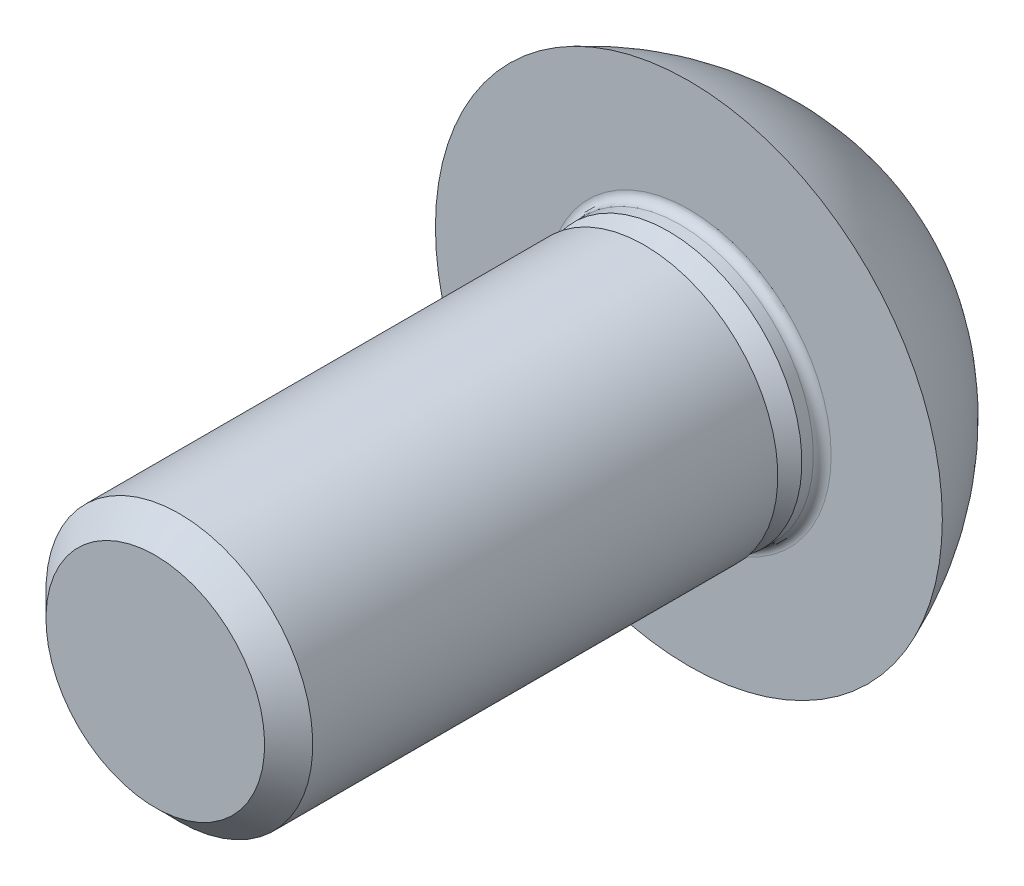
ISO-10303-21;
HEADER;
FILE_DESCRIPTION(('STEP AP214'),'2;1');
FILE_NAME('part.step','',(''),(''),'','','');
FILE_SCHEMA(('AUTOMOTIVE_DESIGN { 1 0 10303 214 1 1 1 1 }'));
ENDSEC;
DATA;
#1=APPLICATION_CONTEXT('core data for automotive mechanical design processes');
#2=APPLICATION_PROTOCOL_DEFINITION('international standard','automotive_design',2000,#1);
#3=PRODUCT_CONTEXT('',#1,'mechanical');
#4=PRODUCT('Part','Part','',(#3));
#5=PRODUCT_RELATED_PRODUCT_CATEGORY('part','',(#4));
#6=PRODUCT_DEFINITION_FORMATION('','',#4);
#7=PRODUCT_DEFINITION_CONTEXT('part definition',#1,'design');
#8=PRODUCT_DEFINITION('design','',#6,#7);
#9=PRODUCT_DEFINITION_SHAPE('','',#8);
#10=(LENGTH_UNIT() NAMED_UNIT(*) SI_UNIT(.MILLI.,.METRE.));
#11=(NAMED_UNIT(*) PLANE_ANGLE_UNIT() SI_UNIT($,.RADIAN.));
#12=(NAMED_UNIT(*) SI_UNIT($,.STERADIAN.) SOLID_ANGLE_UNIT());
#13=UNCERTAINTY_MEASURE_WITH_UNIT(LENGTH_MEASURE(1.E-05),#10,'distance_accuracy_value','');
#14=(GEOMETRIC_REPRESENTATION_CONTEXT(3) GLOBAL_UNCERTAINTY_ASSIGNED_CONTEXT((#13)) GLOBAL_UNIT_ASSIGNED_CONTEXT((#10,
#11,#12)) REPRESENTATION_CONTEXT('',''));
#15=CARTESIAN_POINT('',(0.,0.,0.));
#16=DIRECTION('',(0.,0.,1.));
#17=DIRECTION('',(1.,0.,0.));
#18=AXIS2_PLACEMENT_3D('',#15,#16,#17);
#19=CARTESIAN_POINT('',(0.5,0.866025403784438,-2.65));
#20=DIRECTION('',(0.5,0.866025403784439,0.));
#21=DIRECTION('',(-0.866025403784439,0.5,0.));
#22=AXIS2_PLACEMENT_3D('',#19,#20,#21);
#23=PLANE('',#22);
#24=DIRECTION('',(-0.866025403784439,0.5,0.));
#25=VECTOR('',#24,1.);
#26=CARTESIAN_POINT('',(0.337620236790418,0.959775403784438,-1.65));
#27=LINE('',#26,#25);
#28=CARTESIAN_POINT('',(1.,0.577350269189625,-1.65));
#29=VERTEX_POINT('',#28);
#30=CARTESIAN_POINT('',(0.,1.15470053837925,-1.65));
#31=VERTEX_POINT('',#30);
#32=EDGE_CURVE('E39',#29,#31,#27,.T.);
#33=ORIENTED_EDGE('',*,*,#32,.F.);
#34=DIRECTION('',(0.,0.,1.));
#35=VECTOR('',#34,1.);
#36=CARTESIAN_POINT('',(1.,0.577350269189625,-2.65));
#37=LINE('',#36,#35);
#38=CARTESIAN_POINT('',(1.,0.577350269189625,-0.61));
#39=VERTEX_POINT('',#38);
#40=EDGE_CURVE('E12',#29,#39,#37,.T.);
#41=ORIENTED_EDGE('',*,*,#40,.T.);
#42=DIRECTION('',(0.866025403784439,-0.5,0.));
#43=VECTOR('',#42,1.);
#44=CARTESIAN_POINT('',(1.,0.577350269189625,-0.61));
#45=LINE('',#44,#43);
#46=CARTESIAN_POINT('',(0.5,0.866025403784438,-0.61));
#47=VERTEX_POINT('',#46);
#48=EDGE_CURVE('E235',#47,#39,#45,.T.);
#49=ORIENTED_EDGE('',*,*,#48,.F.);
#50=DIRECTION('',(0.866025403784439,-0.5,0.));
#51=VECTOR('',#50,1.);
#52=CARTESIAN_POINT('',(1.,0.577350269189625,-0.61));
#53=LINE('',#52,#51);
#54=CARTESIAN_POINT('',(0.,1.15470053837925,-0.61));
#55=VERTEX_POINT('',#54);
#56=EDGE_CURVE('E226',#55,#47,#53,.T.);
#57=ORIENTED_EDGE('',*,*,#56,.F.);
#58=DIRECTION('',(0.,0.,1.));
#59=VECTOR('',#58,1.);
#60=CARTESIAN_POINT('',(0.,1.15470053837925,-2.65));
#61=LINE('',#60,#59);
#62=EDGE_CURVE('E31',#31,#55,#61,.T.);
#63=ORIENTED_EDGE('',*,*,#62,.F.);
#64=EDGE_LOOP('',(#33,#41,#49,#57,#63));
#65=FACE_BOUND('',#64,.T.);
#66=ADVANCED_FACE('F19',(#65),#23,.F.);
#67=CARTESIAN_POINT('',(-0.5,0.866025403784439,-2.65));
#68=DIRECTION('',(-0.5,0.866025403784439,0.));
#69=DIRECTION('',(-0.866025403784439,-0.5,0.));
#70=AXIS2_PLACEMENT_3D('',#67,#68,#69);
#71=PLANE('',#70);
#72=DIRECTION('',(-0.866025403784439,-0.5,0.));
#73=VECTOR('',#72,1.);
#74=CARTESIAN_POINT('',(-0.337620236790417,0.959775403784439,-1.65));
#75=LINE('',#74,#73);
#76=CARTESIAN_POINT('',(-1.,0.577350269189626,-1.65));
#77=VERTEX_POINT('',#76);
#78=EDGE_CURVE('E218',#31,#77,#75,.T.);
#79=ORIENTED_EDGE('',*,*,#78,.F.);
#80=ORIENTED_EDGE('',*,*,#62,.T.);
#81=DIRECTION('',(0.866025403784439,0.5,0.));
#82=VECTOR('',#81,1.);
#83=CARTESIAN_POINT('',(0.,1.15470053837925,-0.61));
#84=LINE('',#83,#82);
#85=CARTESIAN_POINT('',(-0.5,0.866025403784439,-0.61));
#86=VERTEX_POINT('',#85);
#87=EDGE_CURVE('E221',#86,#55,#84,.T.);
#88=ORIENTED_EDGE('',*,*,#87,.F.);
#89=DIRECTION('',(0.866025403784439,0.5,0.));
#90=VECTOR('',#89,1.);
#91=CARTESIAN_POINT('',(0.,1.15470053837925,-0.61));
#92=LINE('',#91,#90);
#93=CARTESIAN_POINT('',(-1.,0.577350269189626,-0.61));
#94=VERTEX_POINT('',#93);
#95=EDGE_CURVE('E225',#94,#86,#92,.T.);
#96=ORIENTED_EDGE('',*,*,#95,.F.);
#97=DIRECTION('',(0.,0.,1.));
#98=VECTOR('',#97,1.);
#99=CARTESIAN_POINT('',(-1.,0.577350269189626,-2.65));
#100=LINE('',#99,#98);
#101=EDGE_CURVE('E188',#77,#94,#100,.T.);
#102=ORIENTED_EDGE('',*,*,#101,.F.);
#103=EDGE_LOOP('',(#79,#80,#88,#96,#102));
#104=FACE_BOUND('',#103,.T.);
#105=ADVANCED_FACE('F326',(#104),#71,.F.);
#106=CARTESIAN_POINT('',(-1.,0.,-2.65));
#107=DIRECTION('',(-1.,0.,0.));
#108=DIRECTION('',(0.,-1.,0.));
#109=AXIS2_PLACEMENT_3D('',#106,#107,#108);
#110=PLANE('',#109);
#111=DIRECTION('',(0.,-1.,0.));
#112=VECTOR('',#111,1.);
#113=CARTESIAN_POINT('',(-1.,0.375,-1.65));
#114=LINE('',#113,#112);
#115=CARTESIAN_POINT('',(-1.,-0.577350269189626,-1.65));
#116=VERTEX_POINT('',#115);
#117=EDGE_CURVE('E234',#77,#116,#114,.T.);
#118=ORIENTED_EDGE('',*,*,#117,.F.);
#119=ORIENTED_EDGE('',*,*,#101,.T.);
#120=DIRECTION('',(0.,1.,0.));
#121=VECTOR('',#120,1.);
#122=CARTESIAN_POINT('',(-1.,0.577350269189626,-0.61));
#123=LINE('',#122,#121);
#124=CARTESIAN_POINT('',(-1.,0.,-0.61));
#125=VERTEX_POINT('',#124);
#126=EDGE_CURVE('E207',#125,#94,#123,.T.);
#127=ORIENTED_EDGE('',*,*,#126,.F.);
#128=DIRECTION('',(0.,1.,0.));
#129=VECTOR('',#128,1.);
#130=CARTESIAN_POINT('',(-1.,0.577350269189626,-0.61));
#131=LINE('',#130,#129);
#132=CARTESIAN_POINT('',(-1.,-0.577350269189626,-0.61));
#133=VERTEX_POINT('',#132);
#134=EDGE_CURVE('E190',#133,#125,#131,.T.);
#135=ORIENTED_EDGE('',*,*,#134,.F.);
#136=DIRECTION('',(0.,0.,1.));
#137=VECTOR('',#136,1.);
#138=CARTESIAN_POINT('',(-1.,-0.577350269189626,-2.65));
#139=LINE('',#138,#137);
#140=EDGE_CURVE('E196',#116,#133,#139,.T.);
#141=ORIENTED_EDGE('',*,*,#140,.F.);
#142=EDGE_LOOP('',(#118,#119,#127,#135,#141));
#143=FACE_BOUND('',#142,.T.);
#144=ADVANCED_FACE('F275',(#143),#110,.F.);
#145=CARTESIAN_POINT('',(0.,0.,-0.321324865405187));
#146=DIRECTION('',(0.,0.,-1.));
#147=DIRECTION('',(0.,1.,0.));
#148=AXIS2_PLACEMENT_3D('',#145,#146,#147);
#149=CONICAL_SURFACE('',#148,0.5,1.0471975511966);
#150=CARTESIAN_POINT('',(0.,0.,-0.0326497308103742));
#151=VERTEX_POINT('',#150);
#152=VERTEX_LOOP('',#151);
#153=FACE_BOUND('',#152,.T.);
#154=CARTESIAN_POINT('',(0.,0.,-0.61));
#155=DIRECTION('',(0.,0.,-1.));
#156=DIRECTION('',(0.,1.,0.));
#157=AXIS2_PLACEMENT_3D('',#154,#155,#156);
#158=CIRCLE('',#157,1.);
#159=EDGE_CURVE('E182',#86,#47,#158,.T.);
#160=ORIENTED_EDGE('',*,*,#159,.T.);
#161=CARTESIAN_POINT('',(0.,0.,-0.61));
#162=DIRECTION('',(0.,0.,-1.));
#163=DIRECTION('',(0.,1.,0.));
#164=AXIS2_PLACEMENT_3D('',#161,#162,#163);
#165=CIRCLE('',#164,1.);
#166=CARTESIAN_POINT('',(1.,0.,-0.61));
#167=VERTEX_POINT('',#166);
#168=EDGE_CURVE('E189',#47,#167,#165,.T.);
#169=ORIENTED_EDGE('',*,*,#168,.T.);
#170=CARTESIAN_POINT('',(0.,0.,-0.61));
#171=DIRECTION('',(0.,0.,-1.));
#172=DIRECTION('',(0.,1.,0.));
#173=AXIS2_PLACEMENT_3D('',#170,#171,#172);
#174=CIRCLE('',#173,1.);
#175=CARTESIAN_POINT('',(0.5,-0.866025403784439,-0.61));
#176=VERTEX_POINT('',#175);
#177=EDGE_CURVE('E256',#167,#176,#174,.T.);
#178=ORIENTED_EDGE('',*,*,#177,.T.);
#179=CARTESIAN_POINT('',(0.,0.,-0.61));
#180=DIRECTION('',(0.,0.,-1.));
#181=DIRECTION('',(0.,1.,0.));
#182=AXIS2_PLACEMENT_3D('',#179,#180,#181);
#183=CIRCLE('',#182,1.);
#184=CARTESIAN_POINT('',(-0.5,-0.866025403784439,-0.61));
#185=VERTEX_POINT('',#184);
#186=EDGE_CURVE('E23',#176,#185,#183,.T.);
#187=ORIENTED_EDGE('',*,*,#186,.T.);
#188=CARTESIAN_POINT('',(0.,0.,-0.61));
#189=DIRECTION('',(0.,0.,-1.));
#190=DIRECTION('',(0.,1.,0.));
#191=AXIS2_PLACEMENT_3D('',#188,#189,#190);
#192=CIRCLE('',#191,1.);
#193=EDGE_CURVE('E165',#185,#125,#192,.T.);
#194=ORIENTED_EDGE('',*,*,#193,.T.);
#195=CARTESIAN_POINT('',(0.,0.,-0.61));
#196=DIRECTION('',(0.,0.,-1.));
#197=DIRECTION('',(0.,1.,0.));
#198=AXIS2_PLACEMENT_3D('',#195,#196,#197);
#199=CIRCLE('',#198,1.);
#200=EDGE_CURVE('E170',#125,#86,#199,.T.);
#201=ORIENTED_EDGE('',*,*,#200,.T.);
#202=EDGE_LOOP('',(#160,#169,#178,#187,#194,#201));
#203=FACE_BOUND('',#202,.T.);
#204=ADVANCED_FACE('F313',(#153,#203),#149,.F.);
#205=CARTESIAN_POINT('',(0.,0.,-0.61));
#206=DIRECTION('',(0.,0.,1.));
#207=DIRECTION('',(1.,0.,0.));
#208=AXIS2_PLACEMENT_3D('',#205,#206,#207);
#209=PLANE('',#208);
#210=ORIENTED_EDGE('',*,*,#193,.F.);
#211=DIRECTION('',(-0.866025403784439,0.5,0.));
#212=VECTOR('',#211,1.);
#213=CARTESIAN_POINT('',(-1.,-0.577350269189626,-0.61));
#214=LINE('',#213,#212);
#215=EDGE_CURVE('E287',#185,#133,#214,.T.);
#216=ORIENTED_EDGE('',*,*,#215,.T.);
#217=ORIENTED_EDGE('',*,*,#134,.T.);
#218=EDGE_LOOP('',(#210,#216,#217));
#219=FACE_BOUND('',#218,.T.);
#220=ADVANCED_FACE('F345',(#219),#209,.F.);
#221=CARTESIAN_POINT('',(0.,0.,-0.61));
#222=DIRECTION('',(0.,0.,1.));
#223=DIRECTION('',(1.,0.,0.));
#224=AXIS2_PLACEMENT_3D('',#221,#222,#223);
#225=PLANE('',#224);
#226=ORIENTED_EDGE('',*,*,#200,.F.);
#227=ORIENTED_EDGE('',*,*,#126,.T.);
#228=ORIENTED_EDGE('',*,*,#95,.T.);
#229=EDGE_LOOP('',(#226,#227,#228));
#230=FACE_BOUND('',#229,.T.);
#231=ADVANCED_FACE('F342',(#230),#225,.F.);
#232=CARTESIAN_POINT('',(0.,0.,-0.61));
#233=DIRECTION('',(0.,0.,1.));
#234=DIRECTION('',(1.,0.,0.));
#235=AXIS2_PLACEMENT_3D('',#232,#233,#234);
#236=PLANE('',#235);
#237=ORIENTED_EDGE('',*,*,#159,.F.);
#238=ORIENTED_EDGE('',*,*,#87,.T.);
#239=ORIENTED_EDGE('',*,*,#56,.T.);
#240=EDGE_LOOP('',(#237,#238,#239));
#241=FACE_BOUND('',#240,.T.);
#242=ADVANCED_FACE('F353',(#241),#236,.F.);
#243=CARTESIAN_POINT('',(0.,0.,-0.61));
#244=DIRECTION('',(0.,0.,1.));
#245=DIRECTION('',(1.,0.,0.));
#246=AXIS2_PLACEMENT_3D('',#243,#244,#245);
#247=PLANE('',#246);
#248=ORIENTED_EDGE('',*,*,#168,.F.);
#249=ORIENTED_EDGE('',*,*,#48,.T.);
#250=DIRECTION('',(0.,-1.,0.));
#251=VECTOR('',#250,1.);
#252=CARTESIAN_POINT('',(1.,-0.577350269189626,-0.61));
#253=LINE('',#252,#251);
#254=EDGE_CURVE('E163',#39,#167,#253,.T.);
#255=ORIENTED_EDGE('',*,*,#254,.T.);
#256=EDGE_LOOP('',(#248,#249,#255));
#257=FACE_BOUND('',#256,.T.);
#258=ADVANCED_FACE('F302',(#257),#247,.F.);
#259=CARTESIAN_POINT('',(0.,0.,-0.61));
#260=DIRECTION('',(0.,0.,1.));
#261=DIRECTION('',(1.,0.,0.));
#262=AXIS2_PLACEMENT_3D('',#259,#260,#261);
#263=PLANE('',#262);
#264=ORIENTED_EDGE('',*,*,#177,.F.);
#265=DIRECTION('',(0.,-1.,0.));
#266=VECTOR('',#265,1.);
#267=CARTESIAN_POINT('',(1.,-0.577350269189626,-0.61));
#268=LINE('',#267,#266);
#269=CARTESIAN_POINT('',(1.,-0.577350269189626,-0.61));
#270=VERTEX_POINT('',#269);
#271=EDGE_CURVE('E159',#167,#270,#268,.T.);
#272=ORIENTED_EDGE('',*,*,#271,.T.);
#273=DIRECTION('',(-0.866025403784439,-0.5,0.));
#274=VECTOR('',#273,1.);
#275=CARTESIAN_POINT('',(0.,-1.15470053837925,-0.61));
#276=LINE('',#275,#274);
#277=EDGE_CURVE('E164',#270,#176,#276,.T.);
#278=ORIENTED_EDGE('',*,*,#277,.T.);
#279=EDGE_LOOP('',(#264,#272,#278));
#280=FACE_BOUND('',#279,.T.);
#281=ADVANCED_FACE('F307',(#280),#263,.F.);
#282=CARTESIAN_POINT('',(0.,0.,-0.61));
#283=DIRECTION('',(0.,0.,1.));
#284=DIRECTION('',(1.,0.,0.));
#285=AXIS2_PLACEMENT_3D('',#282,#283,#284);
#286=PLANE('',#285);
#287=ORIENTED_EDGE('',*,*,#186,.F.);
#288=DIRECTION('',(-0.866025403784439,-0.5,0.));
#289=VECTOR('',#288,1.);
#290=CARTESIAN_POINT('',(0.,-1.15470053837925,-0.61));
#291=LINE('',#290,#289);
#292=CARTESIAN_POINT('',(0.,-1.15470053837925,-0.61));
#293=VERTEX_POINT('',#292);
#294=EDGE_CURVE('E195',#176,#293,#291,.T.);
#295=ORIENTED_EDGE('',*,*,#294,.T.);
#296=DIRECTION('',(-0.866025403784439,0.5,0.));
#297=VECTOR('',#296,1.);
#298=CARTESIAN_POINT('',(-1.,-0.577350269189626,-0.61));
#299=LINE('',#298,#297);
#300=EDGE_CURVE('E192',#293,#185,#299,.T.);
#301=ORIENTED_EDGE('',*,*,#300,.T.);
#302=EDGE_LOOP('',(#287,#295,#301));
#303=FACE_BOUND('',#302,.T.);
#304=ADVANCED_FACE('F335',(#303),#286,.F.);
#305=CARTESIAN_POINT('',(-0.5,-0.866025403784439,-2.65));
#306=DIRECTION('',(-0.5,-0.866025403784439,0.));
#307=DIRECTION('',(0.866025403784439,-0.5,0.));
#308=AXIS2_PLACEMENT_3D('',#305,#306,#307);
#309=PLANE('',#308);
#310=DIRECTION('',(0.866025403784439,-0.5,0.));
#311=VECTOR('',#310,1.);
#312=CARTESIAN_POINT('',(-0.662379763209582,-0.772275403784438,-1.65));
#313=LINE('',#312,#311);
#314=CARTESIAN_POINT('',(0.,-1.15470053837925,-1.65));
#315=VERTEX_POINT('',#314);
#316=EDGE_CURVE('E246',#116,#315,#313,.T.);
#317=ORIENTED_EDGE('',*,*,#316,.F.);
#318=ORIENTED_EDGE('',*,*,#140,.T.);
#319=ORIENTED_EDGE('',*,*,#215,.F.);
#320=ORIENTED_EDGE('',*,*,#300,.F.);
#321=DIRECTION('',(0.,0.,1.));
#322=VECTOR('',#321,1.);
#323=CARTESIAN_POINT('',(0.,-1.15470053837925,-2.65));
#324=LINE('',#323,#322);
#325=EDGE_CURVE('E251',#315,#293,#324,.T.);
#326=ORIENTED_EDGE('',*,*,#325,.F.);
#327=EDGE_LOOP('',(#317,#318,#319,#320,#326));
#328=FACE_BOUND('',#327,.T.);
#329=ADVANCED_FACE('F279',(#328),#309,.F.);
#330=CARTESIAN_POINT('',(1.,0.,-2.65));
#331=DIRECTION('',(1.,0.,0.));
#332=DIRECTION('',(0.,1.,0.));
#333=AXIS2_PLACEMENT_3D('',#330,#331,#332);
#334=PLANE('',#333);
#335=DIRECTION('',(0.,1.,0.));
#336=VECTOR('',#335,1.);
#337=CARTESIAN_POINT('',(1.,0.375,-1.65));
#338=LINE('',#337,#336);
#339=CARTESIAN_POINT('',(1.,-0.577350269189626,-1.65));
#340=VERTEX_POINT('',#339);
#341=EDGE_CURVE('E144',#340,#29,#338,.T.);
#342=ORIENTED_EDGE('',*,*,#341,.F.);
#343=DIRECTION('',(0.,0.,1.));
#344=VECTOR('',#343,1.);
#345=CARTESIAN_POINT('',(1.,-0.577350269189626,-2.65));
#346=LINE('',#345,#344);
#347=EDGE_CURVE('E229',#340,#270,#346,.T.);
#348=ORIENTED_EDGE('',*,*,#347,.T.);
#349=ORIENTED_EDGE('',*,*,#271,.F.);
#350=ORIENTED_EDGE('',*,*,#254,.F.);
#351=ORIENTED_EDGE('',*,*,#40,.F.);
#352=EDGE_LOOP('',(#342,#348,#349,#350,#351));
#353=FACE_BOUND('',#352,.T.);
#354=ADVANCED_FACE('F316',(#353),#334,.F.);
#355=CARTESIAN_POINT('',(0.5,-0.866025403784439,-2.65));
#356=DIRECTION('',(0.5,-0.866025403784439,0.));
#357=DIRECTION('',(0.866025403784439,0.5,0.));
#358=AXIS2_PLACEMENT_3D('',#355,#356,#357);
#359=PLANE('',#358);
#360=DIRECTION('',(0.866025403784439,0.5,0.));
#361=VECTOR('',#360,1.);
#362=CARTESIAN_POINT('',(0.662379763209582,-0.772275403784439,-1.65));
#363=LINE('',#362,#361);
#364=EDGE_CURVE('E240',#315,#340,#363,.T.);
#365=ORIENTED_EDGE('',*,*,#364,.F.);
#366=ORIENTED_EDGE('',*,*,#325,.T.);
#367=ORIENTED_EDGE('',*,*,#294,.F.);
#368=ORIENTED_EDGE('',*,*,#277,.F.);
#369=ORIENTED_EDGE('',*,*,#347,.F.);
#370=EDGE_LOOP('',(#365,#366,#367,#368,#369));
#371=FACE_BOUND('',#370,.T.);
#372=ADVANCED_FACE('F319',(#371),#359,.F.);
#373=CARTESIAN_POINT('',(0.,0.75,-1.65));
#374=DIRECTION('',(0.,0.,-1.));
#375=DIRECTION('',(0.,-1.,0.));
#376=AXIS2_PLACEMENT_3D('',#373,#374,#375);
#377=PLANE('',#376);
#378=ORIENTED_EDGE('',*,*,#316,.T.);
#379=ORIENTED_EDGE('',*,*,#364,.T.);
#380=ORIENTED_EDGE('',*,*,#341,.T.);
#381=ORIENTED_EDGE('',*,*,#32,.T.);
#382=ORIENTED_EDGE('',*,*,#78,.T.);
#383=ORIENTED_EDGE('',*,*,#117,.T.);
#384=EDGE_LOOP('',(#378,#379,#380,#381,#382,#383));
#385=FACE_BOUND('',#384,.T.);
#386=CARTESIAN_POINT('',(0.,0.,-1.65));
#387=DIRECTION('',(0.,0.,1.));
#388=DIRECTION('',(0.,1.,0.));
#389=AXIS2_PLACEMENT_3D('',#386,#387,#388);
#390=CIRCLE('',#389,1.5);
#391=CARTESIAN_POINT('',(0.,1.5,-1.65));
#392=VERTEX_POINT('',#391);
#393=EDGE_CURVE('E137',#392,#392,#390,.T.);
#394=ORIENTED_EDGE('',*,*,#393,.F.);
#395=EDGE_LOOP('',(#394));
#396=FACE_BOUND('',#395,.T.);
#397=ADVANCED_FACE('F266',(#385,#396),#377,.T.);
#398=CARTESIAN_POINT('',(0.,0.,1.35243121204053));
#399=DIRECTION('',(0.,0.,1.));
#400=DIRECTION('',(-1.,0.,0.));
#401=AXIS2_PLACEMENT_3D('',#398,#399,#400);
#402=DEGENERATE_TOROIDAL_SURFACE('',#401,0.48630481471621,3.6,.F.);
#403=CARTESIAN_POINT('',(0.,0.,0.));
#404=DIRECTION('',(0.,0.,1.));
#405=DIRECTION('',(0.,1.,0.));
#406=AXIS2_PLACEMENT_3D('',#403,#404,#405);
#407=CIRCLE('',#406,2.85);
#408=CARTESIAN_POINT('',(0.,2.85,0.));
#409=VERTEX_POINT('',#408);
#410=EDGE_CURVE('E123',#409,#409,#407,.T.);
#411=ORIENTED_EDGE('',*,*,#410,.F.);
#412=EDGE_LOOP('',(#411));
#413=FACE_BOUND('',#412,.T.);
#414=ORIENTED_EDGE('',*,*,#393,.T.);
#415=EDGE_LOOP('',(#414));
#416=FACE_BOUND('',#415,.T.);
#417=ADVANCED_FACE('F368',(#413,#416),#402,.F.);
#418=CARTESIAN_POINT('',(0.,2.225,0.));
#419=DIRECTION('',(0.,0.,1.));
#420=DIRECTION('',(0.,1.,0.));
#421=AXIS2_PLACEMENT_3D('',#418,#419,#420);
#422=PLANE('',#421);
#423=CARTESIAN_POINT('',(0.,0.,0.));
#424=DIRECTION('',(0.,0.,1.));
#425=DIRECTION('',(0.,1.,0.));
#426=AXIS2_PLACEMENT_3D('',#423,#424,#425);
#427=CIRCLE('',#426,1.6);
#428=CARTESIAN_POINT('',(0.,1.6,0.));
#429=VERTEX_POINT('',#428);
#430=EDGE_CURVE('E127',#429,#429,#427,.T.);
#431=ORIENTED_EDGE('',*,*,#430,.F.);
#432=EDGE_LOOP('',(#431));
#433=FACE_BOUND('',#432,.T.);
#434=ORIENTED_EDGE('',*,*,#410,.T.);
#435=EDGE_LOOP('',(#434));
#436=FACE_BOUND('',#435,.T.);
#437=ADVANCED_FACE('F128',(#433,#436),#422,.T.);
#438=CARTESIAN_POINT('',(0.,0.,0.1));
#439=DIRECTION('',(0.,0.,1.));
#440=DIRECTION('',(1.,0.,0.));
#441=AXIS2_PLACEMENT_3D('',#438,#439,#440);
#442=TOROIDAL_SURFACE('',#441,1.6,0.1);
#443=CARTESIAN_POINT('',(0.,0.,0.1));
#444=DIRECTION('',(0.,0.,1.));
#445=DIRECTION('',(0.,1.,0.));
#446=AXIS2_PLACEMENT_3D('',#443,#444,#445);
#447=CIRCLE('',#446,1.5);
#448=CARTESIAN_POINT('',(0.,1.5,0.1));
#449=VERTEX_POINT('',#448);
#450=EDGE_CURVE('E132',#449,#449,#447,.T.);
#451=ORIENTED_EDGE('',*,*,#450,.F.);
#452=EDGE_LOOP('',(#451));
#453=FACE_BOUND('',#452,.T.);
#454=ORIENTED_EDGE('',*,*,#430,.T.);
#455=EDGE_LOOP('',(#454));
#456=FACE_BOUND('',#455,.T.);
#457=ADVANCED_FACE('F21',(#453,#456),#442,.F.);
#458=CARTESIAN_POINT('',(0.,0.,0.1646875));
#459=DIRECTION('',(0.,0.,-1.));
#460=DIRECTION('',(0.,1.,0.));
#461=AXIS2_PLACEMENT_3D('',#458,#459,#460);
#462=CYLINDRICAL_SURFACE('',#461,1.5);
#463=CARTESIAN_POINT('',(0.,0.,0.229375));
#464=DIRECTION('',(0.,0.,1.));
#465=DIRECTION('',(0.,1.,0.));
#466=AXIS2_PLACEMENT_3D('',#463,#464,#465);
#467=CIRCLE('',#466,1.5);
#468=CARTESIAN_POINT('',(0.,1.5,0.229375));
#469=VERTEX_POINT('',#468);
#470=EDGE_CURVE('E140',#469,#469,#467,.T.);
#471=ORIENTED_EDGE('',*,*,#470,.F.);
#472=EDGE_LOOP('',(#471));
#473=FACE_BOUND('',#472,.T.);
#474=ORIENTED_EDGE('',*,*,#450,.T.);
#475=EDGE_LOOP('',(#474));
#476=FACE_BOUND('',#475,.T.);
#477=ADVANCED_FACE('F386',(#473,#476),#462,.T.);
#478=CARTESIAN_POINT('',(0.,0.,0.3646875));
#479=DIRECTION('',(0.,0.,-1.));
#480=DIRECTION('',(0.,1.,0.));
#481=AXIS2_PLACEMENT_3D('',#478,#479,#480);
#482=CONICAL_SURFACE('',#481,1.3646875,0.785398163397448);
#483=CARTESIAN_POINT('',(0.,0.,0.5));
#484=DIRECTION('',(0.,0.,1.));
#485=DIRECTION('',(0.,1.,0.));
#486=AXIS2_PLACEMENT_3D('',#483,#484,#485);
#487=CIRCLE('',#486,1.229375);
#488=CARTESIAN_POINT('',(0.,1.229375,0.5));
#489=VERTEX_POINT('',#488);
#490=EDGE_CURVE('E158',#489,#489,#487,.T.);
#491=ORIENTED_EDGE('',*,*,#490,.F.);
#492=EDGE_LOOP('',(#491));
#493=FACE_BOUND('',#492,.T.);
#494=ORIENTED_EDGE('',*,*,#470,.T.);
#495=EDGE_LOOP('',(#494));
#496=FACE_BOUND('',#495,.T.);
#497=ADVANCED_FACE('F373',(#493,#496),#482,.T.);
#498=CARTESIAN_POINT('',(0.,1.3646875,0.5));
#499=DIRECTION('',(0.,0.,-1.));
#500=DIRECTION('',(0.,-1.,0.));
#501=AXIS2_PLACEMENT_3D('',#498,#499,#500);
#502=PLANE('',#501);
#503=CARTESIAN_POINT('',(0.,0.,0.5));
#504=DIRECTION('',(0.,0.,1.));
#505=DIRECTION('',(0.,1.,0.));
#506=AXIS2_PLACEMENT_3D('',#503,#504,#505);
#507=CIRCLE('',#506,1.5);
#508=CARTESIAN_POINT('',(0.,1.5,0.5));
#509=VERTEX_POINT('',#508);
#510=EDGE_CURVE('E153',#509,#509,#507,.T.);
#511=ORIENTED_EDGE('',*,*,#510,.F.);
#512=EDGE_LOOP('',(#511));
#513=FACE_BOUND('',#512,.T.);
#514=ORIENTED_EDGE('',*,*,#490,.T.);
#515=EDGE_LOOP('',(#514));
#516=FACE_BOUND('',#515,.T.);
#517=ADVANCED_FACE('F369',(#513,#516),#502,.T.);
#518=CARTESIAN_POINT('',(0.,0.,3.1146875));
#519=DIRECTION('',(0.,0.,-1.));
#520=DIRECTION('',(0.,1.,0.));
#521=AXIS2_PLACEMENT_3D('',#518,#519,#520);
#522=CYLINDRICAL_SURFACE('',#521,1.5);
#523=CARTESIAN_POINT('',(0.,0.,5.729375));
#524=DIRECTION('',(0.,0.,1.));
#525=DIRECTION('',(0.,1.,0.));
#526=AXIS2_PLACEMENT_3D('',#523,#524,#525);
#527=CIRCLE('',#526,1.5);
#528=CARTESIAN_POINT('',(0.,1.5,5.729375));
#529=VERTEX_POINT('',#528);
#530=EDGE_CURVE('E86',#529,#529,#527,.T.);
#531=ORIENTED_EDGE('',*,*,#530,.F.);
#532=EDGE_LOOP('',(#531));
#533=FACE_BOUND('',#532,.T.);
#534=ORIENTED_EDGE('',*,*,#510,.T.);
#535=EDGE_LOOP('',(#534));
#536=FACE_BOUND('',#535,.T.);
#537=ADVANCED_FACE('F372',(#533,#536),#522,.T.);
#538=CARTESIAN_POINT('',(0.,0.,5.8646875));
#539=DIRECTION('',(0.,0.,-1.));
#540=DIRECTION('',(0.,1.,0.));
#541=AXIS2_PLACEMENT_3D('',#538,#539,#540);
#542=CONICAL_SURFACE('',#541,1.3646875,0.785398163397448);
#543=CARTESIAN_POINT('',(0.,0.,6.));
#544=DIRECTION('',(0.,0.,1.));
#545=DIRECTION('',(0.,1.,0.));
#546=AXIS2_PLACEMENT_3D('',#543,#544,#545);
#547=CIRCLE('',#546,1.229375);
#548=CARTESIAN_POINT('',(0.,1.229375,6.));
#549=VERTEX_POINT('',#548);
#550=EDGE_CURVE('E82',#549,#549,#547,.T.);
#551=ORIENTED_EDGE('',*,*,#550,.F.);
#552=EDGE_LOOP('',(#551));
#553=FACE_BOUND('',#552,.T.);
#554=ORIENTED_EDGE('',*,*,#530,.T.);
#555=EDGE_LOOP('',(#554));
#556=FACE_BOUND('',#555,.T.);
#557=ADVANCED_FACE('F378',(#553,#556),#542,.T.);
#558=CARTESIAN_POINT('',(0.,0.6146875,6.));
#559=DIRECTION('',(0.,0.,1.));
#560=DIRECTION('',(0.,1.,0.));
#561=AXIS2_PLACEMENT_3D('',#558,#559,#560);
#562=PLANE('',#561);
#563=ORIENTED_EDGE('',*,*,#550,.T.);
#564=EDGE_LOOP('',(#563));
#565=FACE_BOUND('',#564,.T.);
#566=ADVANCED_FACE('F375',(#565),#562,.T.);
#567=CLOSED_SHELL('',(#66,#105,#144,#204,#220,#231,#242,#258,#281,#304,#329,#354,#372,#397,#417,
#437,#457,#477,#497,#517,#537,#557,#566));
#568=MANIFOLD_SOLID_BREP('B1',#567);
#569=ADVANCED_BREP_SHAPE_REPRESENTATION('',(#18,#568),#14);
#570=SHAPE_DEFINITION_REPRESENTATION(#9,#569);
ENDSEC;
END-ISO-10303-21;
